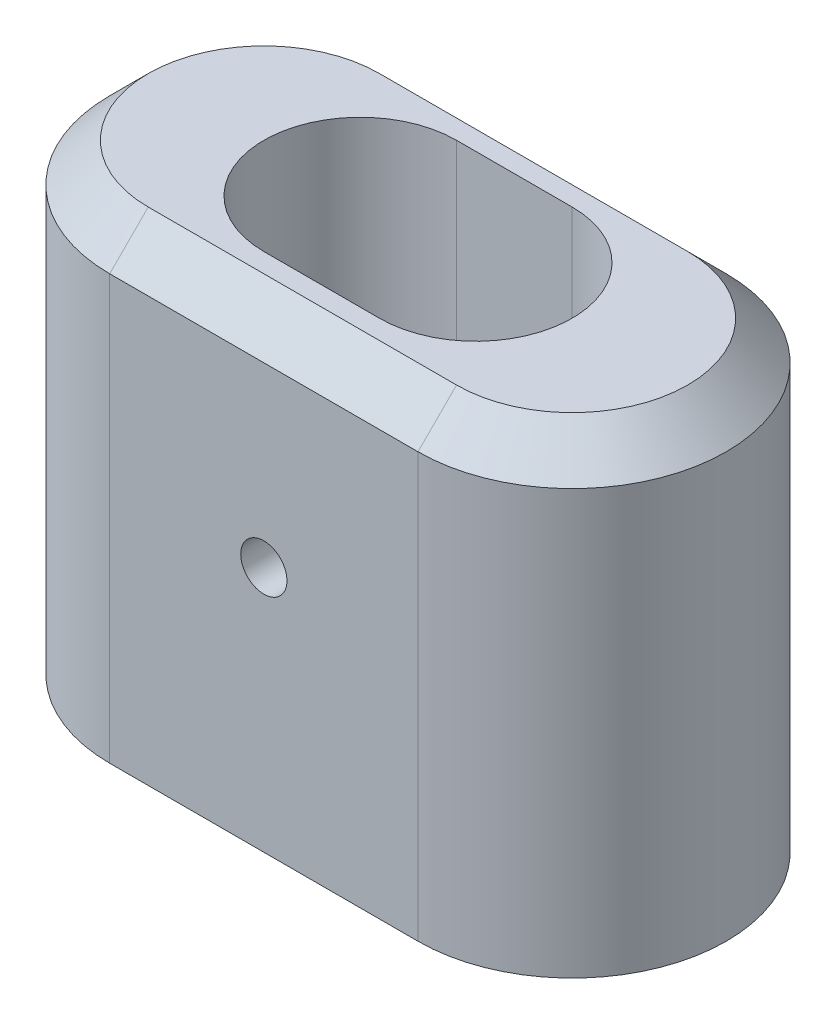
ISO-10303-21;
HEADER;
FILE_DESCRIPTION(('STEP AP214'),'2;1');
FILE_NAME('part.step','',(''),(''),'','','');
FILE_SCHEMA(('AUTOMOTIVE_DESIGN { 1 0 10303 214 1 1 1 1 }'));
ENDSEC;
DATA;
#1=APPLICATION_CONTEXT('core data for automotive mechanical design processes');
#2=APPLICATION_PROTOCOL_DEFINITION('international standard','automotive_design',2000,#1);
#3=PRODUCT_CONTEXT('',#1,'mechanical');
#4=PRODUCT('Part','Part','',(#3));
#5=PRODUCT_RELATED_PRODUCT_CATEGORY('part','',(#4));
#6=PRODUCT_DEFINITION_FORMATION('','',#4);
#7=PRODUCT_DEFINITION_CONTEXT('part definition',#1,'design');
#8=PRODUCT_DEFINITION('design','',#6,#7);
#9=PRODUCT_DEFINITION_SHAPE('','',#8);
#10=(LENGTH_UNIT() NAMED_UNIT(*) SI_UNIT(.MILLI.,.METRE.));
#11=(NAMED_UNIT(*) PLANE_ANGLE_UNIT() SI_UNIT($,.RADIAN.));
#12=(NAMED_UNIT(*) SI_UNIT($,.STERADIAN.) SOLID_ANGLE_UNIT());
#13=UNCERTAINTY_MEASURE_WITH_UNIT(LENGTH_MEASURE(1.E-05),#10,'distance_accuracy_value','');
#14=(GEOMETRIC_REPRESENTATION_CONTEXT(3) GLOBAL_UNCERTAINTY_ASSIGNED_CONTEXT((#13)) GLOBAL_UNIT_ASSIGNED_CONTEXT((#10,
#11,#12)) REPRESENTATION_CONTEXT('',''));
#15=CARTESIAN_POINT('',(0.,0.,0.));
#16=DIRECTION('',(0.,0.,1.));
#17=DIRECTION('',(1.,0.,0.));
#18=AXIS2_PLACEMENT_3D('',#15,#16,#17);
#19=CARTESIAN_POINT('',(-20.,60.,0.));
#20=DIRECTION('',(0.,1.,0.));
#21=DIRECTION('',(0.,0.,1.));
#22=AXIS2_PLACEMENT_3D('',#19,#20,#21);
#23=PLANE('',#22);
#24=CARTESIAN_POINT('',(20.,60.,0.));
#25=DIRECTION('',(0.,1.,0.));
#26=DIRECTION('',(0.,0.,1.));
#27=AXIS2_PLACEMENT_3D('',#24,#25,#26);
#28=CIRCLE('',#27,15.);
#29=CARTESIAN_POINT('',(20.,60.,15.));
#30=VERTEX_POINT('',#29);
#31=CARTESIAN_POINT('',(20.,60.,-15.));
#32=VERTEX_POINT('',#31);
#33=EDGE_CURVE('E182',#30,#32,#28,.T.);
#34=ORIENTED_EDGE('',*,*,#33,.T.);
#35=DIRECTION('',(-1.,0.,0.));
#36=VECTOR('',#35,1.);
#37=CARTESIAN_POINT('',(-20.,60.,-15.));
#38=LINE('',#37,#36);
#39=CARTESIAN_POINT('',(-20.,60.,-15.));
#40=VERTEX_POINT('',#39);
#41=EDGE_CURVE('E186',#32,#40,#38,.T.);
#42=ORIENTED_EDGE('',*,*,#41,.T.);
#43=CARTESIAN_POINT('',(-20.,60.,0.));
#44=DIRECTION('',(0.,1.,0.));
#45=DIRECTION('',(0.,0.,1.));
#46=AXIS2_PLACEMENT_3D('',#43,#44,#45);
#47=CIRCLE('',#46,15.);
#48=CARTESIAN_POINT('',(-20.,60.,15.));
#49=VERTEX_POINT('',#48);
#50=EDGE_CURVE('E184',#40,#49,#47,.T.);
#51=ORIENTED_EDGE('',*,*,#50,.T.);
#52=DIRECTION('',(1.,0.,0.));
#53=VECTOR('',#52,1.);
#54=CARTESIAN_POINT('',(20.,60.,15.));
#55=LINE('',#54,#53);
#56=EDGE_CURVE('E180',#49,#30,#55,.T.);
#57=ORIENTED_EDGE('',*,*,#56,.T.);
#58=EDGE_LOOP('',(#34,#42,#51,#57));
#59=FACE_BOUND('',#58,.T.);
#60=DIRECTION('',(1.,0.,0.));
#61=VECTOR('',#60,1.);
#62=CARTESIAN_POINT('',(7.50000000000001,60.,12.5));
#63=LINE('',#62,#61);
#64=CARTESIAN_POINT('',(-7.49999999999999,60.,12.5));
#65=VERTEX_POINT('',#64);
#66=CARTESIAN_POINT('',(7.50000000000001,60.,12.5));
#67=VERTEX_POINT('',#66);
#68=EDGE_CURVE('E128',#65,#67,#63,.T.);
#69=ORIENTED_EDGE('',*,*,#68,.F.);
#70=CARTESIAN_POINT('',(-7.5,60.,0.));
#71=DIRECTION('',(0.,1.,0.));
#72=DIRECTION('',(0.,0.,1.));
#73=AXIS2_PLACEMENT_3D('',#70,#71,#72);
#74=CIRCLE('',#73,12.5);
#75=CARTESIAN_POINT('',(-7.5,60.,-12.5));
#76=VERTEX_POINT('',#75);
#77=EDGE_CURVE('E118',#76,#65,#74,.T.);
#78=ORIENTED_EDGE('',*,*,#77,.F.);
#79=DIRECTION('',(-1.,0.,0.));
#80=VECTOR('',#79,1.);
#81=CARTESIAN_POINT('',(7.5,60.,-12.5));
#82=LINE('',#81,#80);
#83=CARTESIAN_POINT('',(7.5,60.,-12.5));
#84=VERTEX_POINT('',#83);
#85=EDGE_CURVE('E143',#84,#76,#82,.T.);
#86=ORIENTED_EDGE('',*,*,#85,.F.);
#87=CARTESIAN_POINT('',(7.50000000000001,60.,0.));
#88=DIRECTION('',(0.,1.,0.));
#89=DIRECTION('',(0.,0.,1.));
#90=AXIS2_PLACEMENT_3D('',#87,#88,#89);
#91=CIRCLE('',#90,12.5);
#92=EDGE_CURVE('E141',#67,#84,#91,.T.);
#93=ORIENTED_EDGE('',*,*,#92,.F.);
#94=EDGE_LOOP('',(#69,#78,#86,#93));
#95=FACE_BOUND('',#94,.T.);
#96=ADVANCED_FACE('F39',(#59,#95),#23,.T.);
#97=CARTESIAN_POINT('',(-20.,0.,0.));
#98=DIRECTION('',(0.,1.,0.));
#99=DIRECTION('',(0.,0.,1.));
#100=AXIS2_PLACEMENT_3D('',#97,#98,#99);
#101=PLANE('',#100);
#102=CARTESIAN_POINT('',(-20.,0.,0.));
#103=DIRECTION('',(0.,1.,0.));
#104=DIRECTION('',(0.,0.,1.));
#105=AXIS2_PLACEMENT_3D('',#102,#103,#104);
#106=CIRCLE('',#105,20.);
#107=CARTESIAN_POINT('',(-20.,0.,-20.));
#108=VERTEX_POINT('',#107);
#109=CARTESIAN_POINT('',(-20.,0.,20.));
#110=VERTEX_POINT('',#109);
#111=EDGE_CURVE('E136',#108,#110,#106,.T.);
#112=ORIENTED_EDGE('',*,*,#111,.F.);
#113=DIRECTION('',(-1.,0.,0.));
#114=VECTOR('',#113,1.);
#115=CARTESIAN_POINT('',(-20.,0.,-20.));
#116=LINE('',#115,#114);
#117=CARTESIAN_POINT('',(20.,0.,-20.));
#118=VERTEX_POINT('',#117);
#119=EDGE_CURVE('E169',#118,#108,#116,.T.);
#120=ORIENTED_EDGE('',*,*,#119,.F.);
#121=CARTESIAN_POINT('',(20.,0.,0.));
#122=DIRECTION('',(0.,1.,0.));
#123=DIRECTION('',(0.,0.,1.));
#124=AXIS2_PLACEMENT_3D('',#121,#122,#123);
#125=CIRCLE('',#124,20.);
#126=CARTESIAN_POINT('',(20.,0.,20.));
#127=VERTEX_POINT('',#126);
#128=EDGE_CURVE('E166',#127,#118,#125,.T.);
#129=ORIENTED_EDGE('',*,*,#128,.F.);
#130=DIRECTION('',(1.,0.,0.));
#131=VECTOR('',#130,1.);
#132=CARTESIAN_POINT('',(-20.,0.,20.));
#133=LINE('',#132,#131);
#134=EDGE_CURVE('E163',#110,#127,#133,.T.);
#135=ORIENTED_EDGE('',*,*,#134,.F.);
#136=EDGE_LOOP('',(#112,#120,#129,#135));
#137=FACE_BOUND('',#136,.T.);
#138=CARTESIAN_POINT('',(-7.5,0.,0.));
#139=DIRECTION('',(0.,1.,0.));
#140=DIRECTION('',(0.,0.,1.));
#141=AXIS2_PLACEMENT_3D('',#138,#139,#140);
#142=CIRCLE('',#141,12.5);
#143=CARTESIAN_POINT('',(-7.5,0.,-12.5));
#144=VERTEX_POINT('',#143);
#145=CARTESIAN_POINT('',(-7.49999999999999,0.,12.5));
#146=VERTEX_POINT('',#145);
#147=EDGE_CURVE('E148',#144,#146,#142,.T.);
#148=ORIENTED_EDGE('',*,*,#147,.T.);
#149=DIRECTION('',(1.,0.,0.));
#150=VECTOR('',#149,1.);
#151=CARTESIAN_POINT('',(7.50000000000001,0.,12.5));
#152=LINE('',#151,#150);
#153=CARTESIAN_POINT('',(7.50000000000001,0.,12.5));
#154=VERTEX_POINT('',#153);
#155=EDGE_CURVE('E135',#146,#154,#152,.T.);
#156=ORIENTED_EDGE('',*,*,#155,.T.);
#157=CARTESIAN_POINT('',(7.50000000000001,0.,0.));
#158=DIRECTION('',(0.,1.,0.));
#159=DIRECTION('',(0.,0.,1.));
#160=AXIS2_PLACEMENT_3D('',#157,#158,#159);
#161=CIRCLE('',#160,12.5);
#162=CARTESIAN_POINT('',(7.5,0.,-12.5));
#163=VERTEX_POINT('',#162);
#164=EDGE_CURVE('E152',#154,#163,#161,.T.);
#165=ORIENTED_EDGE('',*,*,#164,.T.);
#166=DIRECTION('',(-1.,0.,0.));
#167=VECTOR('',#166,1.);
#168=CARTESIAN_POINT('',(7.5,0.,-12.5));
#169=LINE('',#168,#167);
#170=EDGE_CURVE('E129',#163,#144,#169,.T.);
#171=ORIENTED_EDGE('',*,*,#170,.T.);
#172=EDGE_LOOP('',(#148,#156,#165,#171));
#173=FACE_BOUND('',#172,.T.);
#174=ADVANCED_FACE('F229',(#137,#173),#101,.F.);
#175=CARTESIAN_POINT('',(-20.,60.,0.));
#176=DIRECTION('',(0.,-1.,0.));
#177=DIRECTION('',(0.,0.,-1.));
#178=AXIS2_PLACEMENT_3D('',#175,#176,#177);
#179=CYLINDRICAL_SURFACE('',#178,20.);
#180=DIRECTION('',(0.,-1.,0.));
#181=VECTOR('',#180,1.);
#182=CARTESIAN_POINT('',(-20.,60.,20.));
#183=LINE('',#182,#181);
#184=CARTESIAN_POINT('',(-20.,55.,20.));
#185=VERTEX_POINT('',#184);
#186=EDGE_CURVE('E178',#185,#110,#183,.T.);
#187=ORIENTED_EDGE('',*,*,#186,.F.);
#188=CARTESIAN_POINT('',(-20.,55.,0.));
#189=DIRECTION('',(0.,1.,0.));
#190=DIRECTION('',(0.,0.,1.));
#191=AXIS2_PLACEMENT_3D('',#188,#189,#190);
#192=CIRCLE('',#191,20.);
#193=CARTESIAN_POINT('',(-20.,55.,-20.));
#194=VERTEX_POINT('',#193);
#195=EDGE_CURVE('E192',#185,#194,#192,.F.);
#196=ORIENTED_EDGE('',*,*,#195,.T.);
#197=DIRECTION('',(0.,-1.,0.));
#198=VECTOR('',#197,1.);
#199=CARTESIAN_POINT('',(-20.,60.,-20.));
#200=LINE('',#199,#198);
#201=EDGE_CURVE('E172',#194,#108,#200,.T.);
#202=ORIENTED_EDGE('',*,*,#201,.T.);
#203=ORIENTED_EDGE('',*,*,#111,.T.);
#204=EDGE_LOOP('',(#187,#196,#202,#203));
#205=FACE_BOUND('',#204,.T.);
#206=ADVANCED_FACE('F218',(#205),#179,.T.);
#207=CARTESIAN_POINT('',(-20.,60.,20.));
#208=DIRECTION('',(0.,0.,-1.));
#209=DIRECTION('',(-1.,0.,0.));
#210=AXIS2_PLACEMENT_3D('',#207,#208,#209);
#211=PLANE('',#210);
#212=CARTESIAN_POINT('',(0.,32.,20.));
#213=DIRECTION('',(0.,0.,-1.));
#214=DIRECTION('',(-1.,0.,0.));
#215=AXIS2_PLACEMENT_3D('',#212,#213,#214);
#216=CIRCLE('',#215,3.);
#217=CARTESIAN_POINT('',(-3.,32.,20.));
#218=VERTEX_POINT('',#217);
#219=EDGE_CURVE('E292',#218,#218,#216,.T.);
#220=ORIENTED_EDGE('',*,*,#219,.T.);
#221=EDGE_LOOP('',(#220));
#222=FACE_BOUND('',#221,.T.);
#223=DIRECTION('',(0.,-1.,0.));
#224=VECTOR('',#223,1.);
#225=CARTESIAN_POINT('',(20.,60.,20.));
#226=LINE('',#225,#224);
#227=CARTESIAN_POINT('',(20.,55.,20.));
#228=VERTEX_POINT('',#227);
#229=EDGE_CURVE('E176',#228,#127,#226,.T.);
#230=ORIENTED_EDGE('',*,*,#229,.F.);
#231=DIRECTION('',(-1.,0.,0.));
#232=VECTOR('',#231,1.);
#233=CARTESIAN_POINT('',(-20.,55.,20.));
#234=LINE('',#233,#232);
#235=EDGE_CURVE('E11',#228,#185,#234,.T.);
#236=ORIENTED_EDGE('',*,*,#235,.T.);
#237=ORIENTED_EDGE('',*,*,#186,.T.);
#238=ORIENTED_EDGE('',*,*,#134,.T.);
#239=EDGE_LOOP('',(#230,#236,#237,#238));
#240=FACE_BOUND('',#239,.T.);
#241=ADVANCED_FACE('F245',(#222,#240),#211,.F.);
#242=CARTESIAN_POINT('',(20.,60.,0.));
#243=DIRECTION('',(0.,-1.,0.));
#244=DIRECTION('',(0.,0.,-1.));
#245=AXIS2_PLACEMENT_3D('',#242,#243,#244);
#246=CYLINDRICAL_SURFACE('',#245,20.);
#247=DIRECTION('',(0.,-1.,0.));
#248=VECTOR('',#247,1.);
#249=CARTESIAN_POINT('',(20.,60.,-20.));
#250=LINE('',#249,#248);
#251=CARTESIAN_POINT('',(20.,55.,-20.));
#252=VERTEX_POINT('',#251);
#253=EDGE_CURVE('E174',#252,#118,#250,.T.);
#254=ORIENTED_EDGE('',*,*,#253,.F.);
#255=CARTESIAN_POINT('',(20.,55.,0.));
#256=DIRECTION('',(0.,1.,0.));
#257=DIRECTION('',(0.,0.,1.));
#258=AXIS2_PLACEMENT_3D('',#255,#256,#257);
#259=CIRCLE('',#258,20.);
#260=EDGE_CURVE('E49',#252,#228,#259,.F.);
#261=ORIENTED_EDGE('',*,*,#260,.T.);
#262=ORIENTED_EDGE('',*,*,#229,.T.);
#263=ORIENTED_EDGE('',*,*,#128,.T.);
#264=EDGE_LOOP('',(#254,#261,#262,#263));
#265=FACE_BOUND('',#264,.T.);
#266=ADVANCED_FACE('F241',(#265),#246,.T.);
#267=CARTESIAN_POINT('',(-20.,60.,-20.));
#268=DIRECTION('',(0.,0.,1.));
#269=DIRECTION('',(1.,0.,0.));
#270=AXIS2_PLACEMENT_3D('',#267,#268,#269);
#271=PLANE('',#270);
#272=CARTESIAN_POINT('',(0.,32.,-20.));
#273=DIRECTION('',(0.,0.,-1.));
#274=DIRECTION('',(-1.,0.,0.));
#275=AXIS2_PLACEMENT_3D('',#272,#273,#274);
#276=CIRCLE('',#275,3.);
#277=CARTESIAN_POINT('',(-3.00000000000001,32.,-20.));
#278=VERTEX_POINT('',#277);
#279=EDGE_CURVE('E294',#278,#278,#276,.T.);
#280=ORIENTED_EDGE('',*,*,#279,.F.);
#281=EDGE_LOOP('',(#280));
#282=FACE_BOUND('',#281,.T.);
#283=ORIENTED_EDGE('',*,*,#201,.F.);
#284=DIRECTION('',(1.,0.,0.));
#285=VECTOR('',#284,1.);
#286=CARTESIAN_POINT('',(20.,55.,-20.));
#287=LINE('',#286,#285);
#288=EDGE_CURVE('E189',#194,#252,#287,.T.);
#289=ORIENTED_EDGE('',*,*,#288,.T.);
#290=ORIENTED_EDGE('',*,*,#253,.T.);
#291=ORIENTED_EDGE('',*,*,#119,.T.);
#292=EDGE_LOOP('',(#283,#289,#290,#291));
#293=FACE_BOUND('',#292,.T.);
#294=ADVANCED_FACE('F221',(#282,#293),#271,.F.);
#295=CARTESIAN_POINT('',(-7.5,60.,0.));
#296=DIRECTION('',(0.,-1.,0.));
#297=DIRECTION('',(0.,0.,-1.));
#298=AXIS2_PLACEMENT_3D('',#295,#296,#297);
#299=CYLINDRICAL_SURFACE('',#298,12.5);
#300=ORIENTED_EDGE('',*,*,#147,.F.);
#301=DIRECTION('',(0.,-1.,0.));
#302=VECTOR('',#301,1.);
#303=CARTESIAN_POINT('',(-7.5,60.,-12.5));
#304=LINE('',#303,#302);
#305=EDGE_CURVE('E124',#76,#144,#304,.T.);
#306=ORIENTED_EDGE('',*,*,#305,.F.);
#307=ORIENTED_EDGE('',*,*,#77,.T.);
#308=DIRECTION('',(0.,-1.,0.));
#309=VECTOR('',#308,1.);
#310=CARTESIAN_POINT('',(-7.49999999999999,60.,12.5));
#311=LINE('',#310,#309);
#312=EDGE_CURVE('E121',#65,#146,#311,.T.);
#313=ORIENTED_EDGE('',*,*,#312,.T.);
#314=EDGE_LOOP('',(#300,#306,#307,#313));
#315=FACE_BOUND('',#314,.T.);
#316=ADVANCED_FACE('F120',(#315),#299,.F.);
#317=CARTESIAN_POINT('',(7.50000000000001,60.,12.5));
#318=DIRECTION('',(0.,0.,-1.));
#319=DIRECTION('',(-1.,0.,0.));
#320=AXIS2_PLACEMENT_3D('',#317,#318,#319);
#321=PLANE('',#320);
#322=CARTESIAN_POINT('',(0.,32.,12.5));
#323=DIRECTION('',(0.,0.,-1.));
#324=DIRECTION('',(-1.,0.,0.));
#325=AXIS2_PLACEMENT_3D('',#322,#323,#324);
#326=CIRCLE('',#325,3.);
#327=CARTESIAN_POINT('',(-3.,32.,12.5));
#328=VERTEX_POINT('',#327);
#329=EDGE_CURVE('E198',#328,#328,#326,.T.);
#330=ORIENTED_EDGE('',*,*,#329,.F.);
#331=EDGE_LOOP('',(#330));
#332=FACE_BOUND('',#331,.T.);
#333=ORIENTED_EDGE('',*,*,#155,.F.);
#334=ORIENTED_EDGE('',*,*,#312,.F.);
#335=ORIENTED_EDGE('',*,*,#68,.T.);
#336=DIRECTION('',(0.,-1.,0.));
#337=VECTOR('',#336,1.);
#338=CARTESIAN_POINT('',(7.50000000000001,60.,12.5));
#339=LINE('',#338,#337);
#340=EDGE_CURVE('E137',#67,#154,#339,.T.);
#341=ORIENTED_EDGE('',*,*,#340,.T.);
#342=EDGE_LOOP('',(#333,#334,#335,#341));
#343=FACE_BOUND('',#342,.T.);
#344=ADVANCED_FACE('F132',(#332,#343),#321,.T.);
#345=CARTESIAN_POINT('',(7.50000000000001,60.,0.));
#346=DIRECTION('',(0.,-1.,0.));
#347=DIRECTION('',(0.,0.,-1.));
#348=AXIS2_PLACEMENT_3D('',#345,#346,#347);
#349=CYLINDRICAL_SURFACE('',#348,12.5);
#350=ORIENTED_EDGE('',*,*,#164,.F.);
#351=ORIENTED_EDGE('',*,*,#340,.F.);
#352=ORIENTED_EDGE('',*,*,#92,.T.);
#353=DIRECTION('',(0.,-1.,0.));
#354=VECTOR('',#353,1.);
#355=CARTESIAN_POINT('',(7.5,60.,-12.5));
#356=LINE('',#355,#354);
#357=EDGE_CURVE('E158',#84,#163,#356,.T.);
#358=ORIENTED_EDGE('',*,*,#357,.T.);
#359=EDGE_LOOP('',(#350,#351,#352,#358));
#360=FACE_BOUND('',#359,.T.);
#361=ADVANCED_FACE('F272',(#360),#349,.F.);
#362=CARTESIAN_POINT('',(7.5,60.,-12.5));
#363=DIRECTION('',(0.,0.,1.));
#364=DIRECTION('',(1.,0.,0.));
#365=AXIS2_PLACEMENT_3D('',#362,#363,#364);
#366=PLANE('',#365);
#367=CARTESIAN_POINT('',(0.,32.,-12.5));
#368=DIRECTION('',(0.,0.,1.));
#369=DIRECTION('',(1.,0.,0.));
#370=AXIS2_PLACEMENT_3D('',#367,#368,#369);
#371=CIRCLE('',#370,3.);
#372=CARTESIAN_POINT('',(-3.00000000000001,32.,-12.5));
#373=VERTEX_POINT('',#372);
#374=EDGE_CURVE('E44',#373,#373,#371,.T.);
#375=ORIENTED_EDGE('',*,*,#374,.F.);
#376=EDGE_LOOP('',(#375));
#377=FACE_BOUND('',#376,.T.);
#378=ORIENTED_EDGE('',*,*,#170,.F.);
#379=ORIENTED_EDGE('',*,*,#357,.F.);
#380=ORIENTED_EDGE('',*,*,#85,.T.);
#381=ORIENTED_EDGE('',*,*,#305,.T.);
#382=EDGE_LOOP('',(#378,#379,#380,#381));
#383=FACE_BOUND('',#382,.T.);
#384=ADVANCED_FACE('F268',(#377,#383),#366,.T.);
#385=CARTESIAN_POINT('',(-20.,60.,15.));
#386=DIRECTION('',(0.,0.707106781186547,0.707106781186549));
#387=DIRECTION('',(-1.,0.,0.));
#388=AXIS2_PLACEMENT_3D('',#385,#386,#387);
#389=PLANE('',#388);
#390=DIRECTION('',(0.,0.707106781186549,-0.707106781186547));
#391=VECTOR('',#390,1.);
#392=CARTESIAN_POINT('',(-20.,55.,20.));
#393=LINE('',#392,#391);
#394=EDGE_CURVE('E200',#185,#49,#393,.T.);
#395=ORIENTED_EDGE('',*,*,#394,.F.);
#396=ORIENTED_EDGE('',*,*,#235,.F.);
#397=DIRECTION('',(0.,-0.707106781186549,0.707106781186547));
#398=VECTOR('',#397,1.);
#399=CARTESIAN_POINT('',(20.,60.,15.));
#400=LINE('',#399,#398);
#401=EDGE_CURVE('E150',#30,#228,#400,.T.);
#402=ORIENTED_EDGE('',*,*,#401,.F.);
#403=ORIENTED_EDGE('',*,*,#56,.F.);
#404=EDGE_LOOP('',(#395,#396,#402,#403));
#405=FACE_BOUND('',#404,.T.);
#406=ADVANCED_FACE('F42',(#405),#389,.T.);
#407=CARTESIAN_POINT('',(20.,60.,0.));
#408=DIRECTION('',(0.,-1.,0.));
#409=DIRECTION('',(0.,0.,-1.));
#410=AXIS2_PLACEMENT_3D('',#407,#408,#409);
#411=CONICAL_SURFACE('',#410,15.,0.785398163397447);
#412=ORIENTED_EDGE('',*,*,#401,.T.);
#413=ORIENTED_EDGE('',*,*,#260,.F.);
#414=DIRECTION('',(0.,-0.707106781186549,-0.707106781186547));
#415=VECTOR('',#414,1.);
#416=CARTESIAN_POINT('',(20.,60.,-15.));
#417=LINE('',#416,#415);
#418=EDGE_CURVE('E197',#32,#252,#417,.T.);
#419=ORIENTED_EDGE('',*,*,#418,.F.);
#420=ORIENTED_EDGE('',*,*,#33,.F.);
#421=EDGE_LOOP('',(#412,#413,#419,#420));
#422=FACE_BOUND('',#421,.T.);
#423=ADVANCED_FACE('F206',(#422),#411,.T.);
#424=CARTESIAN_POINT('',(-20.,60.,0.));
#425=DIRECTION('',(0.,-1.,0.));
#426=DIRECTION('',(0.,0.,-1.));
#427=AXIS2_PLACEMENT_3D('',#424,#425,#426);
#428=CONICAL_SURFACE('',#427,15.,0.785398163397447);
#429=ORIENTED_EDGE('',*,*,#394,.T.);
#430=ORIENTED_EDGE('',*,*,#50,.F.);
#431=DIRECTION('',(0.,0.707106781186549,0.707106781186547));
#432=VECTOR('',#431,1.);
#433=CARTESIAN_POINT('',(-20.,55.,-20.));
#434=LINE('',#433,#432);
#435=EDGE_CURVE('E195',#194,#40,#434,.T.);
#436=ORIENTED_EDGE('',*,*,#435,.F.);
#437=ORIENTED_EDGE('',*,*,#195,.F.);
#438=EDGE_LOOP('',(#429,#430,#436,#437));
#439=FACE_BOUND('',#438,.T.);
#440=ADVANCED_FACE('F215',(#439),#428,.T.);
#441=CARTESIAN_POINT('',(-20.,60.,-15.));
#442=DIRECTION('',(0.,0.707106781186547,-0.707106781186549));
#443=DIRECTION('',(1.,0.,0.));
#444=AXIS2_PLACEMENT_3D('',#441,#442,#443);
#445=PLANE('',#444);
#446=ORIENTED_EDGE('',*,*,#418,.T.);
#447=ORIENTED_EDGE('',*,*,#288,.F.);
#448=ORIENTED_EDGE('',*,*,#435,.T.);
#449=ORIENTED_EDGE('',*,*,#41,.F.);
#450=EDGE_LOOP('',(#446,#447,#448,#449));
#451=FACE_BOUND('',#450,.T.);
#452=ADVANCED_FACE('F225',(#451),#445,.T.);
#453=CARTESIAN_POINT('',(0.,32.,20.));
#454=DIRECTION('',(0.,0.,-1.));
#455=DIRECTION('',(-1.,0.,0.));
#456=AXIS2_PLACEMENT_3D('',#453,#454,#455);
#457=CYLINDRICAL_SURFACE('',#456,3.);
#458=CARTESIAN_POINT('',(-3.00000000000001,32.,-12.5));
#459=CARTESIAN_POINT('',(-3.00000000000001,32.,-12.578125));
#460=CARTESIAN_POINT('',(-3.00000000000001,32.,-12.65625));
#461=CARTESIAN_POINT('',(-3.00000000000001,32.,-12.8125));
#462=CARTESIAN_POINT('',(-3.00000000000001,32.,-12.890625));
#463=CARTESIAN_POINT('',(-3.00000000000001,32.,-13.046875));
#464=CARTESIAN_POINT('',(-3.00000000000001,32.,-13.125));
#465=CARTESIAN_POINT('',(-3.00000000000001,32.,-13.28125));
#466=CARTESIAN_POINT('',(-3.00000000000001,32.,-13.359375));
#467=CARTESIAN_POINT('',(-3.00000000000001,32.,-13.515625));
#468=CARTESIAN_POINT('',(-3.00000000000001,32.,-13.59375));
#469=CARTESIAN_POINT('',(-3.00000000000001,32.,-13.75));
#470=CARTESIAN_POINT('',(-3.00000000000001,32.,-13.828125));
#471=CARTESIAN_POINT('',(-3.00000000000001,32.,-13.984375));
#472=CARTESIAN_POINT('',(-3.00000000000001,32.,-14.0625));
#473=CARTESIAN_POINT('',(-3.00000000000001,32.,-14.21875));
#474=CARTESIAN_POINT('',(-3.00000000000001,32.,-14.296875));
#475=CARTESIAN_POINT('',(-3.00000000000001,32.,-14.453125));
#476=CARTESIAN_POINT('',(-3.00000000000001,32.,-14.53125));
#477=CARTESIAN_POINT('',(-3.00000000000001,32.,-14.6875));
#478=CARTESIAN_POINT('',(-3.00000000000001,32.,-14.765625));
#479=CARTESIAN_POINT('',(-3.00000000000001,32.,-14.921875));
#480=CARTESIAN_POINT('',(-3.00000000000001,32.,-15.));
#481=CARTESIAN_POINT('',(-3.00000000000001,32.,-15.15625));
#482=CARTESIAN_POINT('',(-3.00000000000001,32.,-15.234375));
#483=CARTESIAN_POINT('',(-3.00000000000001,32.,-15.390625));
#484=CARTESIAN_POINT('',(-3.00000000000001,32.,-15.46875));
#485=CARTESIAN_POINT('',(-3.00000000000001,32.,-15.625));
#486=CARTESIAN_POINT('',(-3.00000000000001,32.,-15.703125));
#487=CARTESIAN_POINT('',(-3.00000000000001,32.,-15.859375));
#488=CARTESIAN_POINT('',(-3.00000000000001,32.,-15.9375));
#489=CARTESIAN_POINT('',(-3.00000000000001,32.,-16.09375));
#490=CARTESIAN_POINT('',(-3.00000000000001,32.,-16.171875));
#491=CARTESIAN_POINT('',(-3.00000000000001,32.,-16.328125));
#492=CARTESIAN_POINT('',(-3.00000000000001,32.,-16.40625));
#493=CARTESIAN_POINT('',(-3.00000000000001,32.,-16.5625));
#494=CARTESIAN_POINT('',(-3.00000000000001,32.,-16.640625));
#495=CARTESIAN_POINT('',(-3.00000000000001,32.,-16.796875));
#496=CARTESIAN_POINT('',(-3.00000000000001,32.,-16.875));
#497=CARTESIAN_POINT('',(-3.00000000000001,32.,-17.03125));
#498=CARTESIAN_POINT('',(-3.00000000000001,32.,-17.109375));
#499=CARTESIAN_POINT('',(-3.00000000000001,32.,-17.265625));
#500=CARTESIAN_POINT('',(-3.00000000000001,32.,-17.34375));
#501=CARTESIAN_POINT('',(-3.00000000000001,32.,-17.5));
#502=CARTESIAN_POINT('',(-3.00000000000001,32.,-17.578125));
#503=CARTESIAN_POINT('',(-3.00000000000001,32.,-17.734375));
#504=CARTESIAN_POINT('',(-3.00000000000001,32.,-17.8125));
#505=CARTESIAN_POINT('',(-3.00000000000001,32.,-17.96875));
#506=CARTESIAN_POINT('',(-3.00000000000001,32.,-18.046875));
#507=CARTESIAN_POINT('',(-3.00000000000001,32.,-18.203125));
#508=CARTESIAN_POINT('',(-3.00000000000001,32.,-18.28125));
#509=CARTESIAN_POINT('',(-3.00000000000001,32.,-18.4375));
#510=CARTESIAN_POINT('',(-3.00000000000001,32.,-18.515625));
#511=CARTESIAN_POINT('',(-3.00000000000001,32.,-18.671875));
#512=CARTESIAN_POINT('',(-3.00000000000001,32.,-18.75));
#513=CARTESIAN_POINT('',(-3.00000000000001,32.,-18.90625));
#514=CARTESIAN_POINT('',(-3.00000000000001,32.,-18.984375));
#515=CARTESIAN_POINT('',(-3.00000000000001,32.,-19.140625));
#516=CARTESIAN_POINT('',(-3.00000000000001,32.,-19.21875));
#517=CARTESIAN_POINT('',(-3.00000000000001,32.,-19.375));
#518=CARTESIAN_POINT('',(-3.00000000000001,32.,-19.453125));
#519=CARTESIAN_POINT('',(-3.00000000000001,32.,-19.609375));
#520=CARTESIAN_POINT('',(-3.00000000000001,32.,-19.6875));
#521=CARTESIAN_POINT('',(-3.00000000000001,32.,-19.84375));
#522=CARTESIAN_POINT('',(-3.00000000000001,32.,-19.921875));
#523=CARTESIAN_POINT('',(-3.00000000000001,32.,-20.));
#524=B_SPLINE_CURVE_WITH_KNOTS('',3,(#458,#459,#460,#461,#462,#463,#464,#465,#466,#467,#468,
#469,#470,#471,#472,#473,#474,#475,#476,#477,#478,#479,#480,#481,#482,#483,#484,#485,#486,#487,
#488,#489,#490,#491,#492,#493,#494,#495,#496,#497,#498,#499,#500,#501,#502,#503,#504,#505,#506,
#507,#508,#509,#510,#511,#512,#513,#514,#515,#516,#517,#518,#519,#520,#521,#522,#523),
.UNSPECIFIED.,.F.,.F.,(4,2,2,2,2,2,2,2,2,2,2,2,2,2,2,2,2,2,2,2,2,2,2,2,2,2,2,2,2,2,2,2,4),(0.,
0.234375000000002,0.468750000000004,0.703124999999999,0.937500000000001,1.171875,1.40625,
1.640625,1.875,2.109375,2.34375000000001,2.578125,2.8125,3.046875,3.28125,3.515625,3.75,
3.98437500000001,4.21875000000001,4.453125,4.6875,4.92187500000001,5.15625,5.390625,
5.62500000000001,5.85937500000001,6.09375000000001,6.328125,6.56250000000001,6.79687500000001,
7.03125,7.265625,7.50000000000001),.UNSPECIFIED.);
#525=EDGE_CURVE('BSEAM257',#373,#278,#524,.T.);
#526=ORIENTED_EDGE('',*,*,#374,.T.);
#527=ORIENTED_EDGE('',*,*,#279,.T.);
#528=ORIENTED_EDGE('',*,*,#525,.T.);
#529=ORIENTED_EDGE('',*,*,#525,.F.);
#530=EDGE_LOOP('',(#526,#528,#527,#529));
#531=FACE_BOUND('',#530,.T.);
#532=ADVANCED_FACE('F257',(#531),#457,.F.);
#533=CARTESIAN_POINT('',(-3.,32.,12.5));
#534=CARTESIAN_POINT('',(-3.,32.,12.578125));
#535=CARTESIAN_POINT('',(-3.,32.,12.65625));
#536=CARTESIAN_POINT('',(-3.,32.,12.8125));
#537=CARTESIAN_POINT('',(-3.,32.,12.890625));
#538=CARTESIAN_POINT('',(-3.,32.,13.046875));
#539=CARTESIAN_POINT('',(-3.,32.,13.125));
#540=CARTESIAN_POINT('',(-3.,32.,13.28125));
#541=CARTESIAN_POINT('',(-3.,32.,13.359375));
#542=CARTESIAN_POINT('',(-3.,32.,13.515625));
#543=CARTESIAN_POINT('',(-3.,32.,13.59375));
#544=CARTESIAN_POINT('',(-3.,32.,13.75));
#545=CARTESIAN_POINT('',(-3.,32.,13.828125));
#546=CARTESIAN_POINT('',(-3.,32.,13.984375));
#547=CARTESIAN_POINT('',(-3.,32.,14.0625));
#548=CARTESIAN_POINT('',(-3.,32.,14.21875));
#549=CARTESIAN_POINT('',(-3.,32.,14.296875));
#550=CARTESIAN_POINT('',(-3.,32.,14.453125));
#551=CARTESIAN_POINT('',(-3.,32.,14.53125));
#552=CARTESIAN_POINT('',(-3.,32.,14.6875));
#553=CARTESIAN_POINT('',(-3.,32.,14.765625));
#554=CARTESIAN_POINT('',(-3.,32.,14.921875));
#555=CARTESIAN_POINT('',(-3.,32.,15.));
#556=CARTESIAN_POINT('',(-3.,32.,15.15625));
#557=CARTESIAN_POINT('',(-3.,32.,15.234375));
#558=CARTESIAN_POINT('',(-3.,32.,15.390625));
#559=CARTESIAN_POINT('',(-3.,32.,15.46875));
#560=CARTESIAN_POINT('',(-3.,32.,15.625));
#561=CARTESIAN_POINT('',(-3.,32.,15.703125));
#562=CARTESIAN_POINT('',(-3.,32.,15.859375));
#563=CARTESIAN_POINT('',(-3.,32.,15.9375));
#564=CARTESIAN_POINT('',(-3.,32.,16.09375));
#565=CARTESIAN_POINT('',(-3.,32.,16.171875));
#566=CARTESIAN_POINT('',(-3.,32.,16.328125));
#567=CARTESIAN_POINT('',(-3.,32.,16.40625));
#568=CARTESIAN_POINT('',(-3.,32.,16.5625));
#569=CARTESIAN_POINT('',(-3.,32.,16.640625));
#570=CARTESIAN_POINT('',(-3.,32.,16.796875));
#571=CARTESIAN_POINT('',(-3.,32.,16.875));
#572=CARTESIAN_POINT('',(-3.,32.,17.03125));
#573=CARTESIAN_POINT('',(-3.,32.,17.109375));
#574=CARTESIAN_POINT('',(-3.,32.,17.265625));
#575=CARTESIAN_POINT('',(-3.,32.,17.34375));
#576=CARTESIAN_POINT('',(-3.,32.,17.5));
#577=CARTESIAN_POINT('',(-3.,32.,17.578125));
#578=CARTESIAN_POINT('',(-3.,32.,17.734375));
#579=CARTESIAN_POINT('',(-3.,32.,17.8125));
#580=CARTESIAN_POINT('',(-3.,32.,17.96875));
#581=CARTESIAN_POINT('',(-3.,32.,18.046875));
#582=CARTESIAN_POINT('',(-3.,32.,18.203125));
#583=CARTESIAN_POINT('',(-3.,32.,18.28125));
#584=CARTESIAN_POINT('',(-3.,32.,18.4375));
#585=CARTESIAN_POINT('',(-3.,32.,18.515625));
#586=CARTESIAN_POINT('',(-3.,32.,18.671875));
#587=CARTESIAN_POINT('',(-3.,32.,18.75));
#588=CARTESIAN_POINT('',(-3.,32.,18.90625));
#589=CARTESIAN_POINT('',(-3.,32.,18.984375));
#590=CARTESIAN_POINT('',(-3.,32.,19.140625));
#591=CARTESIAN_POINT('',(-3.,32.,19.21875));
#592=CARTESIAN_POINT('',(-3.,32.,19.375));
#593=CARTESIAN_POINT('',(-3.,32.,19.453125));
#594=CARTESIAN_POINT('',(-3.,32.,19.609375));
#595=CARTESIAN_POINT('',(-3.,32.,19.6875));
#596=CARTESIAN_POINT('',(-3.,32.,19.84375));
#597=CARTESIAN_POINT('',(-3.,32.,19.921875));
#598=CARTESIAN_POINT('',(-3.,32.,20.));
#599=B_SPLINE_CURVE_WITH_KNOTS('',3,(#533,#534,#535,#536,#537,#538,#539,#540,#541,#542,#543,
#544,#545,#546,#547,#548,#549,#550,#551,#552,#553,#554,#555,#556,#557,#558,#559,#560,#561,#562,
#563,#564,#565,#566,#567,#568,#569,#570,#571,#572,#573,#574,#575,#576,#577,#578,#579,#580,#581,
#582,#583,#584,#585,#586,#587,#588,#589,#590,#591,#592,#593,#594,#595,#596,#597,#598),
.UNSPECIFIED.,.F.,.F.,(4,2,2,2,2,2,2,2,2,2,2,2,2,2,2,2,2,2,2,2,2,2,2,2,2,2,2,2,2,2,2,2,4),(0.,
0.234374999999998,0.46875,0.703124999999999,0.937500000000001,1.171875,1.40625,1.640625,1.875,
2.109375,2.34375,2.578125,2.8125,3.046875,3.28125,3.515625,3.75,3.98437500000001,4.21875,
4.45312500000001,4.6875,4.92187500000001,5.15625,5.39062500000001,5.62500000000001,
5.85937500000001,6.09375000000001,6.32812500000001,6.56250000000001,6.79687500000001,
7.03125000000001,7.26562500000001,7.50000000000001),.UNSPECIFIED.);
#600=EDGE_CURVE('BSEAM300',#328,#218,#599,.T.);
#601=ORIENTED_EDGE('',*,*,#329,.T.);
#602=ORIENTED_EDGE('',*,*,#219,.F.);
#603=ORIENTED_EDGE('',*,*,#600,.T.);
#604=ORIENTED_EDGE('',*,*,#600,.F.);
#605=EDGE_LOOP('',(#601,#603,#602,#604));
#606=FACE_BOUND('',#605,.T.);
#607=ADVANCED_FACE('F300',(#606),#457,.F.);
#608=CLOSED_SHELL('',(#96,#174,#206,#241,#266,#294,#316,#344,#361,#384,#406,#423,#440,#452,#532,#607));
#609=MANIFOLD_SOLID_BREP('B2',#608);
#610=ADVANCED_BREP_SHAPE_REPRESENTATION('',(#18,#609),#14);
#611=SHAPE_DEFINITION_REPRESENTATION(#9,#610);
ENDSEC;
END-ISO-10303-21;
